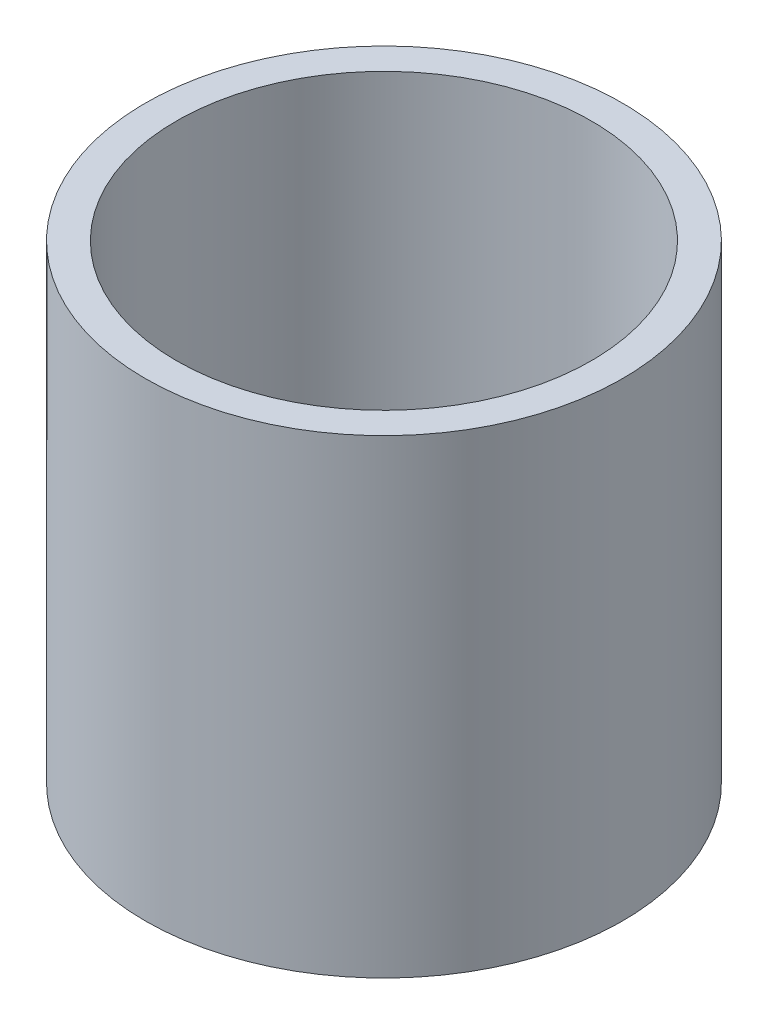
ISO-10303-21;
HEADER;
FILE_DESCRIPTION(('STEP AP214'),'2;1');
FILE_NAME('part.step','',(''),(''),'','','');
FILE_SCHEMA(('AUTOMOTIVE_DESIGN { 1 0 10303 214 1 1 1 1 }'));
ENDSEC;
DATA;
#1=APPLICATION_CONTEXT('core data for automotive mechanical design processes');
#2=APPLICATION_PROTOCOL_DEFINITION('international standard','automotive_design',2000,#1);
#3=PRODUCT_CONTEXT('',#1,'mechanical');
#4=PRODUCT('Part','Part','',(#3));
#5=PRODUCT_RELATED_PRODUCT_CATEGORY('part','',(#4));
#6=PRODUCT_DEFINITION_FORMATION('','',#4);
#7=PRODUCT_DEFINITION_CONTEXT('part definition',#1,'design');
#8=PRODUCT_DEFINITION('design','',#6,#7);
#9=PRODUCT_DEFINITION_SHAPE('','',#8);
#10=(LENGTH_UNIT() NAMED_UNIT(*) SI_UNIT(.MILLI.,.METRE.));
#11=(NAMED_UNIT(*) PLANE_ANGLE_UNIT() SI_UNIT($,.RADIAN.));
#12=(NAMED_UNIT(*) SI_UNIT($,.STERADIAN.) SOLID_ANGLE_UNIT());
#13=UNCERTAINTY_MEASURE_WITH_UNIT(LENGTH_MEASURE(1.E-05),#10,'distance_accuracy_value','');
#14=(GEOMETRIC_REPRESENTATION_CONTEXT(3) GLOBAL_UNCERTAINTY_ASSIGNED_CONTEXT((#13)) GLOBAL_UNIT_ASSIGNED_CONTEXT((#10,
#11,#12)) REPRESENTATION_CONTEXT('',''));
#15=CARTESIAN_POINT('',(0.,0.,0.));
#16=DIRECTION('',(0.,0.,1.));
#17=DIRECTION('',(1.,0.,0.));
#18=AXIS2_PLACEMENT_3D('',#15,#16,#17);
#19=CARTESIAN_POINT('',(0.,25.,0.));
#20=DIRECTION('',(0.,1.,0.));
#21=DIRECTION('',(0.,0.,1.));
#22=AXIS2_PLACEMENT_3D('',#19,#20,#21);
#23=PLANE('',#22);
#24=CARTESIAN_POINT('',(0.,25.,0.));
#25=DIRECTION('',(0.,1.,0.));
#26=DIRECTION('',(0.,0.,1.));
#27=AXIS2_PLACEMENT_3D('',#24,#25,#26);
#28=CIRCLE('',#27,12.7);
#29=CARTESIAN_POINT('',(0.,25.,12.7));
#30=VERTEX_POINT('',#29);
#31=EDGE_CURVE('E10',#30,#30,#28,.T.);
#32=ORIENTED_EDGE('',*,*,#31,.T.);
#33=EDGE_LOOP('',(#32));
#34=FACE_BOUND('',#33,.T.);
#35=CARTESIAN_POINT('',(0.,25.,0.));
#36=DIRECTION('',(0.,1.,0.));
#37=DIRECTION('',(0.,0.,1.));
#38=AXIS2_PLACEMENT_3D('',#35,#36,#37);
#39=CIRCLE('',#38,11.049);
#40=CARTESIAN_POINT('',(0.,25.,11.049));
#41=VERTEX_POINT('',#40);
#42=EDGE_CURVE('E43',#41,#41,#39,.T.);
#43=ORIENTED_EDGE('',*,*,#42,.F.);
#44=EDGE_LOOP('',(#43));
#45=FACE_BOUND('',#44,.T.);
#46=ADVANCED_FACE('F32',(#34,#45),#23,.T.);
#47=CARTESIAN_POINT('',(0.,0.,0.));
#48=DIRECTION('',(0.,1.,0.));
#49=DIRECTION('',(0.,0.,1.));
#50=AXIS2_PLACEMENT_3D('',#47,#48,#49);
#51=PLANE('',#50);
#52=CARTESIAN_POINT('',(0.,0.,0.));
#53=DIRECTION('',(0.,1.,0.));
#54=DIRECTION('',(0.,0.,1.));
#55=AXIS2_PLACEMENT_3D('',#52,#53,#54);
#56=CIRCLE('',#55,12.7);
#57=CARTESIAN_POINT('',(0.,0.,12.7));
#58=VERTEX_POINT('',#57);
#59=EDGE_CURVE('E36',#58,#58,#56,.T.);
#60=ORIENTED_EDGE('',*,*,#59,.F.);
#61=EDGE_LOOP('',(#60));
#62=FACE_BOUND('',#61,.T.);
#63=CARTESIAN_POINT('',(0.,0.,0.));
#64=DIRECTION('',(0.,1.,0.));
#65=DIRECTION('',(0.,0.,1.));
#66=AXIS2_PLACEMENT_3D('',#63,#64,#65);
#67=CIRCLE('',#66,11.049);
#68=CARTESIAN_POINT('',(0.,0.,11.049));
#69=VERTEX_POINT('',#68);
#70=EDGE_CURVE('E45',#69,#69,#67,.T.);
#71=ORIENTED_EDGE('',*,*,#70,.T.);
#72=EDGE_LOOP('',(#71));
#73=FACE_BOUND('',#72,.T.);
#74=ADVANCED_FACE('F55',(#62,#73),#51,.F.);
#75=CARTESIAN_POINT('',(0.,25.,0.));
#76=DIRECTION('',(0.,-1.,0.));
#77=DIRECTION('',(0.,0.,-1.));
#78=AXIS2_PLACEMENT_3D('',#75,#76,#77);
#79=CYLINDRICAL_SURFACE('',#78,12.7);
#80=ORIENTED_EDGE('',*,*,#31,.F.);
#81=EDGE_LOOP('',(#80));
#82=FACE_BOUND('',#81,.T.);
#83=ORIENTED_EDGE('',*,*,#59,.T.);
#84=EDGE_LOOP('',(#83));
#85=FACE_BOUND('',#84,.T.);
#86=ADVANCED_FACE('F34',(#82,#85),#79,.T.);
#87=CARTESIAN_POINT('',(0.,25.,0.));
#88=DIRECTION('',(0.,-1.,0.));
#89=DIRECTION('',(0.,0.,-1.));
#90=AXIS2_PLACEMENT_3D('',#87,#88,#89);
#91=CYLINDRICAL_SURFACE('',#90,11.049);
#92=ORIENTED_EDGE('',*,*,#42,.T.);
#93=EDGE_LOOP('',(#92));
#94=FACE_BOUND('',#93,.T.);
#95=ORIENTED_EDGE('',*,*,#70,.F.);
#96=EDGE_LOOP('',(#95));
#97=FACE_BOUND('',#96,.T.);
#98=ADVANCED_FACE('F51',(#94,#97),#91,.F.);
#99=CLOSED_SHELL('',(#46,#74,#86,#98));
#100=MANIFOLD_SOLID_BREP('B2',#99);
#101=ADVANCED_BREP_SHAPE_REPRESENTATION('',(#18,#100),#14);
#102=SHAPE_DEFINITION_REPRESENTATION(#9,#101);
ENDSEC;
END-ISO-10303-21;
